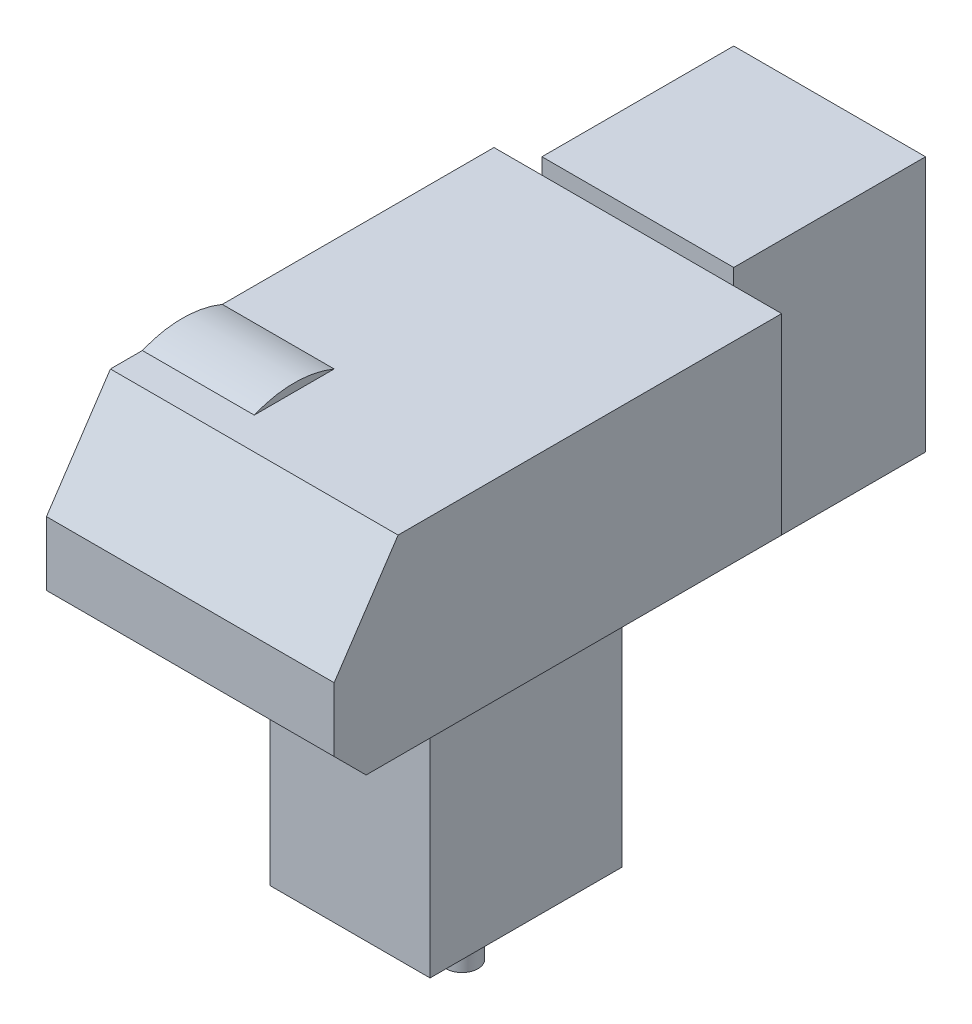
ISO-10303-21;
HEADER;
FILE_DESCRIPTION(('STEP AP214'),'2;1');
FILE_NAME('part.step','',(''),(''),'','','');
FILE_SCHEMA(('AUTOMOTIVE_DESIGN { 1 0 10303 214 1 1 1 1 }'));
ENDSEC;
DATA;
#1=APPLICATION_CONTEXT('core data for automotive mechanical design processes');
#2=APPLICATION_PROTOCOL_DEFINITION('international standard','automotive_design',2000,#1);
#3=PRODUCT_CONTEXT('',#1,'mechanical');
#4=PRODUCT('Part','Part','',(#3));
#5=PRODUCT_RELATED_PRODUCT_CATEGORY('part','',(#4));
#6=PRODUCT_DEFINITION_FORMATION('','',#4);
#7=PRODUCT_DEFINITION_CONTEXT('part definition',#1,'design');
#8=PRODUCT_DEFINITION('design','',#6,#7);
#9=PRODUCT_DEFINITION_SHAPE('','',#8);
#10=(LENGTH_UNIT() NAMED_UNIT(*) SI_UNIT(.MILLI.,.METRE.));
#11=(NAMED_UNIT(*) PLANE_ANGLE_UNIT() SI_UNIT($,.RADIAN.));
#12=(NAMED_UNIT(*) SI_UNIT($,.STERADIAN.) SOLID_ANGLE_UNIT());
#13=UNCERTAINTY_MEASURE_WITH_UNIT(LENGTH_MEASURE(1.E-05),#10,'distance_accuracy_value','');
#14=(GEOMETRIC_REPRESENTATION_CONTEXT(3) GLOBAL_UNCERTAINTY_ASSIGNED_CONTEXT((#13)) GLOBAL_UNIT_ASSIGNED_CONTEXT((#10,
#11,#12)) REPRESENTATION_CONTEXT('',''));
#15=CARTESIAN_POINT('',(0.,0.,0.));
#16=DIRECTION('',(0.,0.,1.));
#17=DIRECTION('',(1.,0.,0.));
#18=AXIS2_PLACEMENT_3D('',#15,#16,#17);
#19=CARTESIAN_POINT('',(-114.3,368.3,-152.4));
#20=DIRECTION('',(0.,0.,-1.));
#21=DIRECTION('',(-1.,0.,0.));
#22=AXIS2_PLACEMENT_3D('',#19,#20,#21);
#23=PLANE('',#22);
#24=DIRECTION('',(0.,-1.,0.));
#25=VECTOR('',#24,1.);
#26=CARTESIAN_POINT('',(76.2,177.8,-152.4));
#27=LINE('',#26,#25);
#28=CARTESIAN_POINT('',(76.2,368.3,-152.4));
#29=VERTEX_POINT('',#28);
#30=CARTESIAN_POINT('',(76.2,215.9,-152.4));
#31=VERTEX_POINT('',#30);
#32=EDGE_CURVE('E55',#29,#31,#27,.T.);
#33=ORIENTED_EDGE('',*,*,#32,.F.);
#34=DIRECTION('',(1.,0.,0.));
#35=VECTOR('',#34,1.);
#36=CARTESIAN_POINT('',(-114.3,368.3,-152.4));
#37=LINE('',#36,#35);
#38=CARTESIAN_POINT('',(114.3,368.3,-152.4));
#39=VERTEX_POINT('',#38);
#40=EDGE_CURVE('E287',#29,#39,#37,.T.);
#41=ORIENTED_EDGE('',*,*,#40,.T.);
#42=DIRECTION('',(0.,-1.,0.));
#43=VECTOR('',#42,1.);
#44=CARTESIAN_POINT('',(114.3,368.3,-152.4));
#45=LINE('',#44,#43);
#46=CARTESIAN_POINT('',(114.3,215.9,-152.4));
#47=VERTEX_POINT('',#46);
#48=EDGE_CURVE('E316',#39,#47,#45,.T.);
#49=ORIENTED_EDGE('',*,*,#48,.T.);
#50=DIRECTION('',(1.,0.,0.));
#51=VECTOR('',#50,1.);
#52=CARTESIAN_POINT('',(-114.3,215.9,-152.4));
#53=LINE('',#52,#51);
#54=EDGE_CURVE('E67',#31,#47,#53,.T.);
#55=ORIENTED_EDGE('',*,*,#54,.F.);
#56=EDGE_LOOP('',(#33,#41,#49,#55));
#57=FACE_BOUND('',#56,.T.);
#58=ADVANCED_FACE('F45',(#57),#23,.T.);
#59=CARTESIAN_POINT('',(-114.3,368.3,203.2));
#60=DIRECTION('',(0.,0.,-1.));
#61=DIRECTION('',(-1.,0.,0.));
#62=AXIS2_PLACEMENT_3D('',#59,#60,#61);
#63=PLANE('',#62);
#64=DIRECTION('',(-1.,0.,0.));
#65=VECTOR('',#64,1.);
#66=CARTESIAN_POINT('',(114.3,292.1,203.2));
#67=LINE('',#66,#65);
#68=CARTESIAN_POINT('',(114.3,292.1,203.2));
#69=VERTEX_POINT('',#68);
#70=CARTESIAN_POINT('',(-114.3,292.1,203.2));
#71=VERTEX_POINT('',#70);
#72=EDGE_CURVE('E231',#69,#71,#67,.T.);
#73=ORIENTED_EDGE('',*,*,#72,.T.);
#74=DIRECTION('',(0.,-1.,0.));
#75=VECTOR('',#74,1.);
#76=CARTESIAN_POINT('',(-114.3,368.3,203.2));
#77=LINE('',#76,#75);
#78=CARTESIAN_POINT('',(-114.3,241.3,203.2));
#79=VERTEX_POINT('',#78);
#80=EDGE_CURVE('E297',#71,#79,#77,.T.);
#81=ORIENTED_EDGE('',*,*,#80,.T.);
#82=DIRECTION('',(-1.,0.,0.));
#83=VECTOR('',#82,1.);
#84=CARTESIAN_POINT('',(114.3,241.3,203.2));
#85=LINE('',#84,#83);
#86=CARTESIAN_POINT('',(114.3,241.3,203.2));
#87=VERTEX_POINT('',#86);
#88=EDGE_CURVE('E246',#87,#79,#85,.T.);
#89=ORIENTED_EDGE('',*,*,#88,.F.);
#90=DIRECTION('',(0.,-1.,0.));
#91=VECTOR('',#90,1.);
#92=CARTESIAN_POINT('',(114.3,368.3,203.2));
#93=LINE('',#92,#91);
#94=EDGE_CURVE('E319',#69,#87,#93,.T.);
#95=ORIENTED_EDGE('',*,*,#94,.F.);
#96=EDGE_LOOP('',(#73,#81,#89,#95));
#97=FACE_BOUND('',#96,.T.);
#98=ADVANCED_FACE('F503',(#97),#63,.F.);
#99=CARTESIAN_POINT('',(114.3,368.3,203.2));
#100=DIRECTION('',(-1.,0.,0.));
#101=DIRECTION('',(0.,0.,1.));
#102=AXIS2_PLACEMENT_3D('',#99,#100,#101);
#103=PLANE('',#102);
#104=DIRECTION('',(0.,0.832050294337844,-0.554700196225229));
#105=VECTOR('',#104,1.);
#106=CARTESIAN_POINT('',(114.3,183.661538461538,275.492307692308));
#107=LINE('',#106,#105);
#108=CARTESIAN_POINT('',(114.3,368.3,152.4));
#109=VERTEX_POINT('',#108);
#110=EDGE_CURVE('E228',#69,#109,#107,.T.);
#111=ORIENTED_EDGE('',*,*,#110,.F.);
#112=ORIENTED_EDGE('',*,*,#94,.T.);
#113=DIRECTION('',(0.,-0.707106781186547,-0.707106781186548));
#114=VECTOR('',#113,1.);
#115=CARTESIAN_POINT('',(114.3,19.0500000000003,-19.0500000000002));
#116=LINE('',#115,#114);
#117=CARTESIAN_POINT('',(114.3,215.9,177.8));
#118=VERTEX_POINT('',#117);
#119=EDGE_CURVE('E222',#87,#118,#116,.T.);
#120=ORIENTED_EDGE('',*,*,#119,.T.);
#121=DIRECTION('',(0.,0.,-1.));
#122=VECTOR('',#121,1.);
#123=CARTESIAN_POINT('',(114.3,215.9,203.2));
#124=LINE('',#123,#122);
#125=EDGE_CURVE('E282',#118,#47,#124,.T.);
#126=ORIENTED_EDGE('',*,*,#125,.T.);
#127=ORIENTED_EDGE('',*,*,#48,.F.);
#128=DIRECTION('',(0.,0.,-1.));
#129=VECTOR('',#128,1.);
#130=CARTESIAN_POINT('',(114.3,368.3,203.2));
#131=LINE('',#130,#129);
#132=EDGE_CURVE('E283',#109,#39,#131,.T.);
#133=ORIENTED_EDGE('',*,*,#132,.F.);
#134=EDGE_LOOP('',(#111,#112,#120,#126,#127,#133));
#135=FACE_BOUND('',#134,.T.);
#136=ADVANCED_FACE('F495',(#135),#103,.F.);
#137=CARTESIAN_POINT('',(-114.3,368.3,203.2));
#138=DIRECTION('',(-1.,0.,0.));
#139=DIRECTION('',(0.,0.,1.));
#140=AXIS2_PLACEMENT_3D('',#137,#138,#139);
#141=PLANE('',#140);
#142=ORIENTED_EDGE('',*,*,#80,.F.);
#143=DIRECTION('',(0.,0.832050294337844,-0.554700196225229));
#144=VECTOR('',#143,1.);
#145=CARTESIAN_POINT('',(-114.3,183.661538461538,275.492307692308));
#146=LINE('',#145,#144);
#147=CARTESIAN_POINT('',(-114.3,368.3,152.4));
#148=VERTEX_POINT('',#147);
#149=EDGE_CURVE('E232',#71,#148,#146,.T.);
#150=ORIENTED_EDGE('',*,*,#149,.T.);
#151=DIRECTION('',(0.,0.,-1.));
#152=VECTOR('',#151,1.);
#153=CARTESIAN_POINT('',(-114.3,368.3,203.2));
#154=LINE('',#153,#152);
#155=CARTESIAN_POINT('',(-114.3,368.3,127.));
#156=VERTEX_POINT('',#155);
#157=EDGE_CURVE('E294',#148,#156,#154,.T.);
#158=ORIENTED_EDGE('',*,*,#157,.T.);
#159=CARTESIAN_POINT('',(-114.3,292.1,95.25));
#160=DIRECTION('',(-1.,0.,0.));
#161=DIRECTION('',(0.,0.,1.));
#162=AXIS2_PLACEMENT_3D('',#159,#160,#161);
#163=CIRCLE('',#162,82.55);
#164=CARTESIAN_POINT('',(-114.3,368.3,63.5));
#165=VERTEX_POINT('',#164);
#166=EDGE_CURVE('E259',#156,#165,#163,.T.);
#167=ORIENTED_EDGE('',*,*,#166,.T.);
#168=CARTESIAN_POINT('',(-114.3,368.3,-152.4));
#169=VERTEX_POINT('',#168);
#170=EDGE_CURVE('E292',#165,#169,#154,.T.);
#171=ORIENTED_EDGE('',*,*,#170,.T.);
#172=DIRECTION('',(0.,-1.,0.));
#173=VECTOR('',#172,1.);
#174=CARTESIAN_POINT('',(-114.3,368.3,-152.4));
#175=LINE('',#174,#173);
#176=CARTESIAN_POINT('',(-114.3,215.9,-152.4));
#177=VERTEX_POINT('',#176);
#178=EDGE_CURVE('E312',#169,#177,#175,.T.);
#179=ORIENTED_EDGE('',*,*,#178,.T.);
#180=DIRECTION('',(0.,0.,-1.));
#181=VECTOR('',#180,1.);
#182=CARTESIAN_POINT('',(-114.3,215.9,203.2));
#183=LINE('',#182,#181);
#184=CARTESIAN_POINT('',(-114.3,215.9,63.4999999999999));
#185=VERTEX_POINT('',#184);
#186=EDGE_CURVE('E305',#185,#177,#183,.T.);
#187=ORIENTED_EDGE('',*,*,#186,.F.);
#188=CARTESIAN_POINT('',(-114.3,215.9,127.));
#189=VERTEX_POINT('',#188);
#190=EDGE_CURVE('E240',#185,#189,#163,.T.);
#191=ORIENTED_EDGE('',*,*,#190,.T.);
#192=CARTESIAN_POINT('',(-114.3,215.9,177.8));
#193=VERTEX_POINT('',#192);
#194=EDGE_CURVE('E288',#193,#189,#183,.T.);
#195=ORIENTED_EDGE('',*,*,#194,.F.);
#196=DIRECTION('',(0.,-0.707106781186547,-0.707106781186548));
#197=VECTOR('',#196,1.);
#198=CARTESIAN_POINT('',(-114.3,19.0500000000003,-19.0500000000002));
#199=LINE('',#198,#197);
#200=EDGE_CURVE('E218',#79,#193,#199,.T.);
#201=ORIENTED_EDGE('',*,*,#200,.F.);
#202=EDGE_LOOP('',(#142,#150,#158,#167,#171,#179,#187,#191,#195,#201));
#203=FACE_BOUND('',#202,.T.);
#204=ADVANCED_FACE('F462',(#203),#141,.T.);
#205=CARTESIAN_POINT('',(0.,368.3,0.));
#206=DIRECTION('',(0.,1.,0.));
#207=DIRECTION('',(0.,0.,1.));
#208=AXIS2_PLACEMENT_3D('',#205,#206,#207);
#209=PLANE('',#208);
#210=ORIENTED_EDGE('',*,*,#157,.F.);
#211=DIRECTION('',(-1.,0.,0.));
#212=VECTOR('',#211,1.);
#213=CARTESIAN_POINT('',(114.3,368.3,152.4));
#214=LINE('',#213,#212);
#215=EDGE_CURVE('E237',#109,#148,#214,.T.);
#216=ORIENTED_EDGE('',*,*,#215,.F.);
#217=ORIENTED_EDGE('',*,*,#132,.T.);
#218=ORIENTED_EDGE('',*,*,#40,.F.);
#219=CARTESIAN_POINT('',(-76.2,368.3,-152.4));
#220=VERTEX_POINT('',#219);
#221=EDGE_CURVE('E293',#220,#29,#37,.T.);
#222=ORIENTED_EDGE('',*,*,#221,.F.);
#223=EDGE_CURVE('E289',#169,#220,#37,.T.);
#224=ORIENTED_EDGE('',*,*,#223,.F.);
#225=ORIENTED_EDGE('',*,*,#170,.F.);
#226=DIRECTION('',(-1.,0.,0.));
#227=VECTOR('',#226,1.);
#228=CARTESIAN_POINT('',(-25.4,368.3,63.5));
#229=LINE('',#228,#227);
#230=CARTESIAN_POINT('',(-25.4,368.3,63.5));
#231=VERTEX_POINT('',#230);
#232=EDGE_CURVE('E49',#231,#165,#229,.T.);
#233=ORIENTED_EDGE('',*,*,#232,.F.);
#234=DIRECTION('',(0.,0.,1.));
#235=VECTOR('',#234,1.);
#236=CARTESIAN_POINT('',(-25.4,368.3,0.));
#237=LINE('',#236,#235);
#238=CARTESIAN_POINT('',(-25.4,368.3,127.));
#239=VERTEX_POINT('',#238);
#240=EDGE_CURVE('E367',#231,#239,#237,.T.);
#241=ORIENTED_EDGE('',*,*,#240,.T.);
#242=DIRECTION('',(-1.,0.,0.));
#243=VECTOR('',#242,1.);
#244=CARTESIAN_POINT('',(-25.4,368.3,127.));
#245=LINE('',#244,#243);
#246=EDGE_CURVE('E370',#156,#239,#245,.F.);
#247=ORIENTED_EDGE('',*,*,#246,.F.);
#248=EDGE_LOOP('',(#210,#216,#217,#218,#222,#224,#225,#233,#241,#247));
#249=FACE_BOUND('',#248,.T.);
#250=ADVANCED_FACE('F475',(#249),#209,.T.);
#251=CARTESIAN_POINT('',(63.5,215.9,76.2));
#252=DIRECTION('',(-1.,0.,0.));
#253=DIRECTION('',(0.,0.,1.));
#254=AXIS2_PLACEMENT_3D('',#251,#252,#253);
#255=PLANE('',#254);
#256=DIRECTION('',(0.,0.,-1.));
#257=VECTOR('',#256,1.);
#258=CARTESIAN_POINT('',(63.5,0.,76.2));
#259=LINE('',#258,#257);
#260=CARTESIAN_POINT('',(63.5,0.,76.2));
#261=VERTEX_POINT('',#260);
#262=CARTESIAN_POINT('',(63.5,0.,-76.2));
#263=VERTEX_POINT('',#262);
#264=EDGE_CURVE('E323',#261,#263,#259,.T.);
#265=ORIENTED_EDGE('',*,*,#264,.T.);
#266=DIRECTION('',(0.,-1.,0.));
#267=VECTOR('',#266,1.);
#268=CARTESIAN_POINT('',(63.5,215.9,-76.2));
#269=LINE('',#268,#267);
#270=CARTESIAN_POINT('',(63.5,215.9,-76.2));
#271=VERTEX_POINT('',#270);
#272=EDGE_CURVE('E363',#271,#263,#269,.T.);
#273=ORIENTED_EDGE('',*,*,#272,.F.);
#274=DIRECTION('',(0.,0.,-1.));
#275=VECTOR('',#274,1.);
#276=CARTESIAN_POINT('',(63.5,215.9,76.2));
#277=LINE('',#276,#275);
#278=CARTESIAN_POINT('',(63.5,215.9,76.2));
#279=VERTEX_POINT('',#278);
#280=EDGE_CURVE('E324',#279,#271,#277,.T.);
#281=ORIENTED_EDGE('',*,*,#280,.F.);
#282=DIRECTION('',(0.,-1.,0.));
#283=VECTOR('',#282,1.);
#284=CARTESIAN_POINT('',(63.5,215.9,76.2));
#285=LINE('',#284,#283);
#286=EDGE_CURVE('E340',#279,#261,#285,.T.);
#287=ORIENTED_EDGE('',*,*,#286,.T.);
#288=EDGE_LOOP('',(#265,#273,#281,#287));
#289=FACE_BOUND('',#288,.T.);
#290=ADVANCED_FACE('F47',(#289),#255,.F.);
#291=CARTESIAN_POINT('',(-63.5,215.9,-76.2));
#292=DIRECTION('',(0.,0.,1.));
#293=DIRECTION('',(1.,0.,0.));
#294=AXIS2_PLACEMENT_3D('',#291,#292,#293);
#295=PLANE('',#294);
#296=DIRECTION('',(-1.,0.,0.));
#297=VECTOR('',#296,1.);
#298=CARTESIAN_POINT('',(-63.5,0.,-76.2));
#299=LINE('',#298,#297);
#300=CARTESIAN_POINT('',(-63.5,0.,-76.2));
#301=VERTEX_POINT('',#300);
#302=EDGE_CURVE('E344',#263,#301,#299,.T.);
#303=ORIENTED_EDGE('',*,*,#302,.T.);
#304=DIRECTION('',(0.,-1.,0.));
#305=VECTOR('',#304,1.);
#306=CARTESIAN_POINT('',(-63.5,215.9,-76.2));
#307=LINE('',#306,#305);
#308=CARTESIAN_POINT('',(-63.5,215.9,-76.2));
#309=VERTEX_POINT('',#308);
#310=EDGE_CURVE('E359',#309,#301,#307,.T.);
#311=ORIENTED_EDGE('',*,*,#310,.F.);
#312=DIRECTION('',(-1.,0.,0.));
#313=VECTOR('',#312,1.);
#314=CARTESIAN_POINT('',(-63.5,215.9,-76.2));
#315=LINE('',#314,#313);
#316=EDGE_CURVE('E328',#271,#309,#315,.T.);
#317=ORIENTED_EDGE('',*,*,#316,.F.);
#318=ORIENTED_EDGE('',*,*,#272,.T.);
#319=EDGE_LOOP('',(#303,#311,#317,#318));
#320=FACE_BOUND('',#319,.T.);
#321=ADVANCED_FACE('F444',(#320),#295,.F.);
#322=CARTESIAN_POINT('',(-63.5,215.9,76.2));
#323=DIRECTION('',(1.,0.,0.));
#324=DIRECTION('',(0.,0.,-1.));
#325=AXIS2_PLACEMENT_3D('',#322,#323,#324);
#326=PLANE('',#325);
#327=DIRECTION('',(0.,-1.,0.));
#328=VECTOR('',#327,1.);
#329=CARTESIAN_POINT('',(-63.5,215.9,76.2));
#330=LINE('',#329,#328);
#331=CARTESIAN_POINT('',(-63.5,211.778147431723,76.2));
#332=VERTEX_POINT('',#331);
#333=CARTESIAN_POINT('',(-63.5,0.,76.2));
#334=VERTEX_POINT('',#333);
#335=EDGE_CURVE('E356',#332,#334,#330,.T.);
#336=ORIENTED_EDGE('',*,*,#335,.F.);
#337=CARTESIAN_POINT('',(-63.5,292.1,95.25));
#338=DIRECTION('',(1.,0.,0.));
#339=DIRECTION('',(0.,0.,-1.));
#340=AXIS2_PLACEMENT_3D('',#337,#338,#339);
#341=CIRCLE('',#340,82.55);
#342=CARTESIAN_POINT('',(-63.5,215.9,63.5));
#343=VERTEX_POINT('',#342);
#344=EDGE_CURVE('E276',#332,#343,#341,.T.);
#345=ORIENTED_EDGE('',*,*,#344,.T.);
#346=DIRECTION('',(0.,0.,1.));
#347=VECTOR('',#346,1.);
#348=CARTESIAN_POINT('',(-63.5,215.9,76.2));
#349=LINE('',#348,#347);
#350=EDGE_CURVE('E333',#309,#343,#349,.T.);
#351=ORIENTED_EDGE('',*,*,#350,.F.);
#352=ORIENTED_EDGE('',*,*,#310,.T.);
#353=DIRECTION('',(0.,0.,1.));
#354=VECTOR('',#353,1.);
#355=CARTESIAN_POINT('',(-63.5,0.,76.2));
#356=LINE('',#355,#354);
#357=EDGE_CURVE('E347',#301,#334,#356,.T.);
#358=ORIENTED_EDGE('',*,*,#357,.T.);
#359=EDGE_LOOP('',(#336,#345,#351,#352,#358));
#360=FACE_BOUND('',#359,.T.);
#361=ADVANCED_FACE('F441',(#360),#326,.F.);
#362=CARTESIAN_POINT('',(-63.5,215.9,76.2));
#363=DIRECTION('',(0.,0.,-1.));
#364=DIRECTION('',(-1.,0.,0.));
#365=AXIS2_PLACEMENT_3D('',#362,#363,#364);
#366=PLANE('',#365);
#367=DIRECTION('',(0.,1.,0.));
#368=VECTOR('',#367,1.);
#369=CARTESIAN_POINT('',(-25.4,215.9,76.2));
#370=LINE('',#369,#368);
#371=CARTESIAN_POINT('',(-25.4,211.778147431723,76.2));
#372=VERTEX_POINT('',#371);
#373=CARTESIAN_POINT('',(-25.4,215.9,76.2));
#374=VERTEX_POINT('',#373);
#375=EDGE_CURVE('E265',#372,#374,#370,.T.);
#376=ORIENTED_EDGE('',*,*,#375,.F.);
#377=DIRECTION('',(-1.,0.,0.));
#378=VECTOR('',#377,1.);
#379=CARTESIAN_POINT('',(-25.4,211.778147431723,76.2));
#380=LINE('',#379,#378);
#381=EDGE_CURVE('E279',#372,#332,#380,.T.);
#382=ORIENTED_EDGE('',*,*,#381,.T.);
#383=ORIENTED_EDGE('',*,*,#335,.T.);
#384=DIRECTION('',(1.,0.,0.));
#385=VECTOR('',#384,1.);
#386=CARTESIAN_POINT('',(-63.5,0.,76.2));
#387=LINE('',#386,#385);
#388=EDGE_CURVE('E329',#334,#261,#387,.T.);
#389=ORIENTED_EDGE('',*,*,#388,.T.);
#390=ORIENTED_EDGE('',*,*,#286,.F.);
#391=DIRECTION('',(1.,0.,0.));
#392=VECTOR('',#391,1.);
#393=CARTESIAN_POINT('',(-63.5,215.9,76.2));
#394=LINE('',#393,#392);
#395=EDGE_CURVE('E337',#374,#279,#394,.T.);
#396=ORIENTED_EDGE('',*,*,#395,.F.);
#397=EDGE_LOOP('',(#376,#382,#383,#389,#390,#396));
#398=FACE_BOUND('',#397,.T.);
#399=ADVANCED_FACE('F426',(#398),#366,.F.);
#400=CARTESIAN_POINT('',(0.,0.,0.));
#401=DIRECTION('',(0.,-1.,0.));
#402=DIRECTION('',(0.,0.,-1.));
#403=AXIS2_PLACEMENT_3D('',#400,#401,#402);
#404=PLANE('',#403);
#405=CARTESIAN_POINT('',(0.,0.,-12.7));
#406=DIRECTION('',(0.,-1.,0.));
#407=DIRECTION('',(0.,0.,-1.));
#408=AXIS2_PLACEMENT_3D('',#405,#406,#407);
#409=CIRCLE('',#408,12.7);
#410=CARTESIAN_POINT('',(0.,0.,-25.4));
#411=VERTEX_POINT('',#410);
#412=EDGE_CURVE('E11',#411,#411,#409,.T.);
#413=ORIENTED_EDGE('',*,*,#412,.F.);
#414=EDGE_LOOP('',(#413));
#415=FACE_BOUND('',#414,.T.);
#416=ORIENTED_EDGE('',*,*,#264,.F.);
#417=ORIENTED_EDGE('',*,*,#388,.F.);
#418=ORIENTED_EDGE('',*,*,#357,.F.);
#419=ORIENTED_EDGE('',*,*,#302,.F.);
#420=EDGE_LOOP('',(#416,#417,#418,#419));
#421=FACE_BOUND('',#420,.T.);
#422=ADVANCED_FACE('F422',(#415,#421),#404,.T.);
#423=CARTESIAN_POINT('',(0.,215.9,0.));
#424=DIRECTION('',(0.,1.,0.));
#425=DIRECTION('',(0.,0.,1.));
#426=AXIS2_PLACEMENT_3D('',#423,#424,#425);
#427=PLANE('',#426);
#428=ORIENTED_EDGE('',*,*,#125,.F.);
#429=DIRECTION('',(-1.,0.,0.));
#430=VECTOR('',#429,1.);
#431=CARTESIAN_POINT('',(114.3,215.9,177.8));
#432=LINE('',#431,#430);
#433=EDGE_CURVE('E236',#118,#193,#432,.T.);
#434=ORIENTED_EDGE('',*,*,#433,.T.);
#435=ORIENTED_EDGE('',*,*,#194,.T.);
#436=DIRECTION('',(-1.,0.,0.));
#437=VECTOR('',#436,1.);
#438=CARTESIAN_POINT('',(-25.4,215.9,127.));
#439=LINE('',#438,#437);
#440=CARTESIAN_POINT('',(-25.4,215.9,127.));
#441=VERTEX_POINT('',#440);
#442=EDGE_CURVE('E269',#189,#441,#439,.F.);
#443=ORIENTED_EDGE('',*,*,#442,.T.);
#444=DIRECTION('',(0.,0.,1.));
#445=VECTOR('',#444,1.);
#446=CARTESIAN_POINT('',(-25.4,215.9,0.));
#447=LINE('',#446,#445);
#448=EDGE_CURVE('E257',#374,#441,#447,.T.);
#449=ORIENTED_EDGE('',*,*,#448,.F.);
#450=ORIENTED_EDGE('',*,*,#395,.T.);
#451=ORIENTED_EDGE('',*,*,#280,.T.);
#452=ORIENTED_EDGE('',*,*,#316,.T.);
#453=ORIENTED_EDGE('',*,*,#350,.T.);
#454=DIRECTION('',(-1.,0.,0.));
#455=VECTOR('',#454,1.);
#456=CARTESIAN_POINT('',(-25.4,215.9,63.5));
#457=LINE('',#456,#455);
#458=EDGE_CURVE('E272',#343,#185,#457,.T.);
#459=ORIENTED_EDGE('',*,*,#458,.T.);
#460=ORIENTED_EDGE('',*,*,#186,.T.);
#461=CARTESIAN_POINT('',(-76.2,215.9,-152.4));
#462=VERTEX_POINT('',#461);
#463=EDGE_CURVE('E301',#177,#462,#53,.T.);
#464=ORIENTED_EDGE('',*,*,#463,.T.);
#465=EDGE_CURVE('E306',#462,#31,#53,.T.);
#466=ORIENTED_EDGE('',*,*,#465,.T.);
#467=ORIENTED_EDGE('',*,*,#54,.T.);
#468=EDGE_LOOP('',(#428,#434,#435,#443,#449,#450,#451,#452,#453,#459,#460,#464,#466,#467));
#469=FACE_BOUND('',#468,.T.);
#470=ADVANCED_FACE('F425',(#469),#427,.F.);
#471=DIRECTION('',(0.,1.,0.));
#472=VECTOR('',#471,1.);
#473=CARTESIAN_POINT('',(-76.2,177.8,-152.4));
#474=LINE('',#473,#472);
#475=EDGE_CURVE('E378',#462,#220,#474,.T.);
#476=ORIENTED_EDGE('',*,*,#475,.F.);
#477=ORIENTED_EDGE('',*,*,#463,.F.);
#478=ORIENTED_EDGE('',*,*,#178,.F.);
#479=ORIENTED_EDGE('',*,*,#223,.T.);
#480=EDGE_LOOP('',(#476,#477,#478,#479));
#481=FACE_BOUND('',#480,.T.);
#482=ADVANCED_FACE('F470',(#481),#23,.T.);
#483=CARTESIAN_POINT('',(-25.4,292.1,95.25));
#484=DIRECTION('',(-1.,0.,0.));
#485=DIRECTION('',(0.,0.,1.));
#486=AXIS2_PLACEMENT_3D('',#483,#484,#485);
#487=PLANE('',#486);
#488=ORIENTED_EDGE('',*,*,#240,.F.);
#489=CARTESIAN_POINT('',(-25.4,292.1,95.25));
#490=DIRECTION('',(-1.,0.,0.));
#491=DIRECTION('',(0.,0.,1.));
#492=AXIS2_PLACEMENT_3D('',#489,#490,#491);
#493=CIRCLE('',#492,82.55);
#494=EDGE_CURVE('E253',#239,#231,#493,.T.);
#495=ORIENTED_EDGE('',*,*,#494,.F.);
#496=EDGE_LOOP('',(#488,#495));
#497=FACE_BOUND('',#496,.T.);
#498=ADVANCED_FACE('F507',(#497),#487,.F.);
#499=CARTESIAN_POINT('',(-25.4,292.1,95.25));
#500=DIRECTION('',(-1.,0.,0.));
#501=DIRECTION('',(0.,0.,1.));
#502=AXIS2_PLACEMENT_3D('',#499,#500,#501);
#503=CYLINDRICAL_SURFACE('',#502,82.55);
#504=ORIENTED_EDGE('',*,*,#494,.T.);
#505=ORIENTED_EDGE('',*,*,#232,.T.);
#506=ORIENTED_EDGE('',*,*,#166,.F.);
#507=ORIENTED_EDGE('',*,*,#246,.T.);
#508=EDGE_LOOP('',(#504,#505,#506,#507));
#509=FACE_BOUND('',#508,.T.);
#510=ADVANCED_FACE('F508',(#509),#503,.T.);
#511=ORIENTED_EDGE('',*,*,#381,.F.);
#512=EDGE_CURVE('E258',#372,#441,#493,.T.);
#513=ORIENTED_EDGE('',*,*,#512,.T.);
#514=ORIENTED_EDGE('',*,*,#442,.F.);
#515=ORIENTED_EDGE('',*,*,#190,.F.);
#516=ORIENTED_EDGE('',*,*,#458,.F.);
#517=ORIENTED_EDGE('',*,*,#344,.F.);
#518=EDGE_LOOP('',(#511,#513,#514,#515,#516,#517));
#519=FACE_BOUND('',#518,.T.);
#520=ADVANCED_FACE('F454',(#519),#503,.T.);
#521=ORIENTED_EDGE('',*,*,#512,.F.);
#522=ORIENTED_EDGE('',*,*,#375,.T.);
#523=ORIENTED_EDGE('',*,*,#448,.T.);
#524=EDGE_LOOP('',(#521,#522,#523));
#525=FACE_BOUND('',#524,.T.);
#526=ADVANCED_FACE('F452',(#525),#487,.F.);
#527=CARTESIAN_POINT('',(114.3,183.661538461538,275.492307692308));
#528=DIRECTION('',(0.,0.554700196225229,0.832050294337844));
#529=DIRECTION('',(0.,-0.832050294337844,0.554700196225229));
#530=AXIS2_PLACEMENT_3D('',#527,#528,#529);
#531=PLANE('',#530);
#532=ORIENTED_EDGE('',*,*,#149,.F.);
#533=ORIENTED_EDGE('',*,*,#72,.F.);
#534=ORIENTED_EDGE('',*,*,#110,.T.);
#535=ORIENTED_EDGE('',*,*,#215,.T.);
#536=EDGE_LOOP('',(#532,#533,#534,#535));
#537=FACE_BOUND('',#536,.T.);
#538=ADVANCED_FACE('F609',(#537),#531,.T.);
#539=CARTESIAN_POINT('',(114.3,19.0500000000003,-19.0500000000002));
#540=DIRECTION('',(0.,0.707106781186548,-0.707106781186546));
#541=DIRECTION('',(0.,0.707106781186547,0.707106781186548));
#542=AXIS2_PLACEMENT_3D('',#539,#540,#541);
#543=PLANE('',#542);
#544=ORIENTED_EDGE('',*,*,#200,.T.);
#545=ORIENTED_EDGE('',*,*,#433,.F.);
#546=ORIENTED_EDGE('',*,*,#119,.F.);
#547=ORIENTED_EDGE('',*,*,#88,.T.);
#548=EDGE_LOOP('',(#544,#545,#546,#547));
#549=FACE_BOUND('',#548,.T.);
#550=ADVANCED_FACE('F505',(#549),#543,.F.);
#551=CARTESIAN_POINT('',(0.,0.,-152.4));
#552=DIRECTION('',(0.,0.,-1.));
#553=DIRECTION('',(-1.,0.,0.));
#554=AXIS2_PLACEMENT_3D('',#551,#552,#553);
#555=PLANE('',#554);
#556=CARTESIAN_POINT('',(-76.2,381.,-152.4));
#557=VERTEX_POINT('',#556);
#558=EDGE_CURVE('E385',#220,#557,#474,.T.);
#559=ORIENTED_EDGE('',*,*,#558,.F.);
#560=ORIENTED_EDGE('',*,*,#221,.T.);
#561=CARTESIAN_POINT('',(76.2,381.,-152.4));
#562=VERTEX_POINT('',#561);
#563=EDGE_CURVE('E390',#562,#29,#27,.T.);
#564=ORIENTED_EDGE('',*,*,#563,.F.);
#565=DIRECTION('',(1.,0.,0.));
#566=VECTOR('',#565,1.);
#567=CARTESIAN_POINT('',(-76.2,381.,-152.4));
#568=LINE('',#567,#566);
#569=EDGE_CURVE('E210',#557,#562,#568,.T.);
#570=ORIENTED_EDGE('',*,*,#569,.F.);
#571=EDGE_LOOP('',(#559,#560,#564,#570));
#572=FACE_BOUND('',#571,.T.);
#573=ADVANCED_FACE('F480',(#572),#555,.F.);
#574=CARTESIAN_POINT('',(76.2,177.8,-304.8));
#575=DIRECTION('',(-1.,0.,0.));
#576=DIRECTION('',(0.,0.,1.));
#577=AXIS2_PLACEMENT_3D('',#574,#575,#576);
#578=PLANE('',#577);
#579=ORIENTED_EDGE('',*,*,#563,.T.);
#580=ORIENTED_EDGE('',*,*,#32,.T.);
#581=CARTESIAN_POINT('',(76.2,177.8,-152.4));
#582=VERTEX_POINT('',#581);
#583=EDGE_CURVE('E215',#31,#582,#27,.T.);
#584=ORIENTED_EDGE('',*,*,#583,.T.);
#585=DIRECTION('',(0.,0.,1.));
#586=VECTOR('',#585,1.);
#587=CARTESIAN_POINT('',(76.2,177.8,-304.8));
#588=LINE('',#587,#586);
#589=CARTESIAN_POINT('',(76.2,177.8,-304.8));
#590=VERTEX_POINT('',#589);
#591=EDGE_CURVE('E193',#590,#582,#588,.T.);
#592=ORIENTED_EDGE('',*,*,#591,.F.);
#593=DIRECTION('',(0.,-1.,0.));
#594=VECTOR('',#593,1.);
#595=CARTESIAN_POINT('',(76.2,177.8,-304.8));
#596=LINE('',#595,#594);
#597=CARTESIAN_POINT('',(76.2,381.,-304.8));
#598=VERTEX_POINT('',#597);
#599=EDGE_CURVE('E200',#598,#590,#596,.T.);
#600=ORIENTED_EDGE('',*,*,#599,.F.);
#601=DIRECTION('',(0.,0.,1.));
#602=VECTOR('',#601,1.);
#603=CARTESIAN_POINT('',(76.2,381.,-304.8));
#604=LINE('',#603,#602);
#605=EDGE_CURVE('E404',#598,#562,#604,.T.);
#606=ORIENTED_EDGE('',*,*,#605,.T.);
#607=EDGE_LOOP('',(#579,#580,#584,#592,#600,#606));
#608=FACE_BOUND('',#607,.T.);
#609=ADVANCED_FACE('F213',(#608),#578,.F.);
#610=CARTESIAN_POINT('',(-76.2,177.8,-304.8));
#611=DIRECTION('',(0.,1.,0.));
#612=DIRECTION('',(0.,0.,1.));
#613=AXIS2_PLACEMENT_3D('',#610,#611,#612);
#614=PLANE('',#613);
#615=DIRECTION('',(-1.,0.,0.));
#616=VECTOR('',#615,1.);
#617=CARTESIAN_POINT('',(-76.2,177.8,-152.4));
#618=LINE('',#617,#616);
#619=CARTESIAN_POINT('',(-76.2,177.8,-152.4));
#620=VERTEX_POINT('',#619);
#621=EDGE_CURVE('E395',#582,#620,#618,.T.);
#622=ORIENTED_EDGE('',*,*,#621,.T.);
#623=DIRECTION('',(0.,0.,1.));
#624=VECTOR('',#623,1.);
#625=CARTESIAN_POINT('',(-76.2,177.8,-304.8));
#626=LINE('',#625,#624);
#627=CARTESIAN_POINT('',(-76.2,177.8,-304.8));
#628=VERTEX_POINT('',#627);
#629=EDGE_CURVE('E195',#628,#620,#626,.T.);
#630=ORIENTED_EDGE('',*,*,#629,.F.);
#631=DIRECTION('',(-1.,0.,0.));
#632=VECTOR('',#631,1.);
#633=CARTESIAN_POINT('',(-76.2,177.8,-304.8));
#634=LINE('',#633,#632);
#635=EDGE_CURVE('E189',#590,#628,#634,.T.);
#636=ORIENTED_EDGE('',*,*,#635,.F.);
#637=ORIENTED_EDGE('',*,*,#591,.T.);
#638=EDGE_LOOP('',(#622,#630,#636,#637));
#639=FACE_BOUND('',#638,.T.);
#640=ADVANCED_FACE('F191',(#639),#614,.F.);
#641=CARTESIAN_POINT('',(-76.2,177.8,-304.8));
#642=DIRECTION('',(1.,0.,0.));
#643=DIRECTION('',(0.,0.,-1.));
#644=AXIS2_PLACEMENT_3D('',#641,#642,#643);
#645=PLANE('',#644);
#646=EDGE_CURVE('E384',#620,#462,#474,.T.);
#647=ORIENTED_EDGE('',*,*,#646,.T.);
#648=ORIENTED_EDGE('',*,*,#475,.T.);
#649=ORIENTED_EDGE('',*,*,#558,.T.);
#650=DIRECTION('',(0.,0.,1.));
#651=VECTOR('',#650,1.);
#652=CARTESIAN_POINT('',(-76.2,381.,-304.8));
#653=LINE('',#652,#651);
#654=CARTESIAN_POINT('',(-76.2,381.,-304.8));
#655=VERTEX_POINT('',#654);
#656=EDGE_CURVE('E224',#655,#557,#653,.T.);
#657=ORIENTED_EDGE('',*,*,#656,.F.);
#658=DIRECTION('',(0.,1.,0.));
#659=VECTOR('',#658,1.);
#660=CARTESIAN_POINT('',(-76.2,177.8,-304.8));
#661=LINE('',#660,#659);
#662=EDGE_CURVE('E199',#628,#655,#661,.T.);
#663=ORIENTED_EDGE('',*,*,#662,.F.);
#664=ORIENTED_EDGE('',*,*,#629,.T.);
#665=EDGE_LOOP('',(#647,#648,#649,#657,#663,#664));
#666=FACE_BOUND('',#665,.T.);
#667=ADVANCED_FACE('F487',(#666),#645,.F.);
#668=CARTESIAN_POINT('',(-76.2,381.,-304.8));
#669=DIRECTION('',(0.,-1.,0.));
#670=DIRECTION('',(0.,0.,-1.));
#671=AXIS2_PLACEMENT_3D('',#668,#669,#670);
#672=PLANE('',#671);
#673=ORIENTED_EDGE('',*,*,#569,.T.);
#674=ORIENTED_EDGE('',*,*,#605,.F.);
#675=DIRECTION('',(1.,0.,0.));
#676=VECTOR('',#675,1.);
#677=CARTESIAN_POINT('',(-76.2,381.,-304.8));
#678=LINE('',#677,#676);
#679=EDGE_CURVE('E205',#655,#598,#678,.T.);
#680=ORIENTED_EDGE('',*,*,#679,.F.);
#681=ORIENTED_EDGE('',*,*,#656,.T.);
#682=EDGE_LOOP('',(#673,#674,#680,#681));
#683=FACE_BOUND('',#682,.T.);
#684=ADVANCED_FACE('F486',(#683),#672,.F.);
#685=CARTESIAN_POINT('',(0.,0.,-304.8));
#686=DIRECTION('',(0.,0.,-1.));
#687=DIRECTION('',(-1.,0.,0.));
#688=AXIS2_PLACEMENT_3D('',#685,#686,#687);
#689=PLANE('',#688);
#690=ORIENTED_EDGE('',*,*,#599,.T.);
#691=ORIENTED_EDGE('',*,*,#635,.T.);
#692=ORIENTED_EDGE('',*,*,#662,.T.);
#693=ORIENTED_EDGE('',*,*,#679,.T.);
#694=EDGE_LOOP('',(#690,#691,#692,#693));
#695=FACE_BOUND('',#694,.T.);
#696=ADVANCED_FACE('F203',(#695),#689,.T.);
#697=ORIENTED_EDGE('',*,*,#465,.F.);
#698=ORIENTED_EDGE('',*,*,#646,.F.);
#699=ORIENTED_EDGE('',*,*,#621,.F.);
#700=ORIENTED_EDGE('',*,*,#583,.F.);
#701=EDGE_LOOP('',(#697,#698,#699,#700));
#702=FACE_BOUND('',#701,.T.);
#703=ADVANCED_FACE('F418',(#702),#555,.F.);
#704=CARTESIAN_POINT('',(0.,-63.5,-12.7));
#705=DIRECTION('',(0.,1.,0.));
#706=DIRECTION('',(0.,0.,1.));
#707=AXIS2_PLACEMENT_3D('',#704,#705,#706);
#708=CYLINDRICAL_SURFACE('',#707,12.7);
#709=CARTESIAN_POINT('',(0.,-63.5,-12.7));
#710=DIRECTION('',(0.,-1.,0.));
#711=DIRECTION('',(0.,0.,-1.));
#712=AXIS2_PLACEMENT_3D('',#709,#710,#711);
#713=CIRCLE('',#712,12.7);
#714=CARTESIAN_POINT('',(0.,-63.5,-25.4));
#715=VERTEX_POINT('',#714);
#716=EDGE_CURVE('E407',#715,#715,#713,.T.);
#717=ORIENTED_EDGE('',*,*,#716,.F.);
#718=EDGE_LOOP('',(#717));
#719=FACE_BOUND('',#718,.T.);
#720=ORIENTED_EDGE('',*,*,#412,.T.);
#721=EDGE_LOOP('',(#720));
#722=FACE_BOUND('',#721,.T.);
#723=ADVANCED_FACE('F415',(#719,#722),#708,.T.);
#724=CARTESIAN_POINT('',(0.,-63.5,-12.7));
#725=DIRECTION('',(0.,-1.,0.));
#726=DIRECTION('',(0.,0.,-1.));
#727=AXIS2_PLACEMENT_3D('',#724,#725,#726);
#728=PLANE('',#727);
#729=ORIENTED_EDGE('',*,*,#716,.T.);
#730=EDGE_LOOP('',(#729));
#731=FACE_BOUND('',#730,.T.);
#732=ADVANCED_FACE('F413',(#731),#728,.T.);
#733=CLOSED_SHELL('',(#58,#98,#136,#204,#250,#290,#321,#361,#399,#422,#470,#482,#498,#510,#520,
#526,#538,#550,#573,#609,#640,#667,#684,#696,#703,#723,#732));
#734=MANIFOLD_SOLID_BREP('B2',#733);
#735=ADVANCED_BREP_SHAPE_REPRESENTATION('',(#18,#734),#14);
#736=SHAPE_DEFINITION_REPRESENTATION(#9,#735);
ENDSEC;
END-ISO-10303-21;
